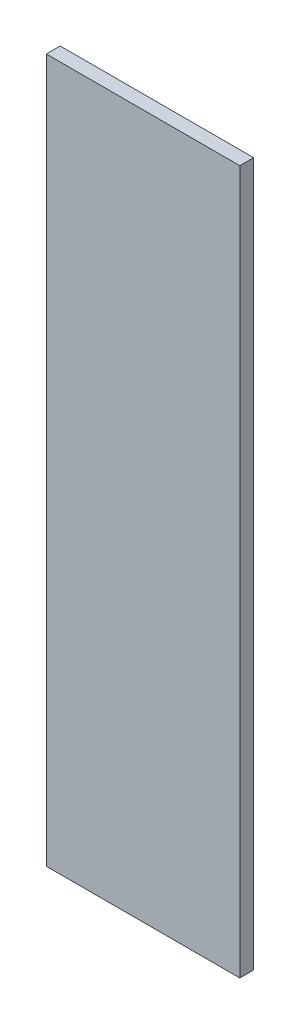
ISO-10303-21;
HEADER;
FILE_DESCRIPTION(('STEP AP214'),'2;1');
FILE_NAME('part.step','',(''),(''),'','','');
FILE_SCHEMA(('AUTOMOTIVE_DESIGN { 1 0 10303 214 1 1 1 1 }'));
ENDSEC;
DATA;
#1=APPLICATION_CONTEXT('core data for automotive mechanical design processes');
#2=APPLICATION_PROTOCOL_DEFINITION('international standard','automotive_design',2000,#1);
#3=PRODUCT_CONTEXT('',#1,'mechanical');
#4=PRODUCT('Part','Part','',(#3));
#5=PRODUCT_RELATED_PRODUCT_CATEGORY('part','',(#4));
#6=PRODUCT_DEFINITION_FORMATION('','',#4);
#7=PRODUCT_DEFINITION_CONTEXT('part definition',#1,'design');
#8=PRODUCT_DEFINITION('design','',#6,#7);
#9=PRODUCT_DEFINITION_SHAPE('','',#8);
#10=(LENGTH_UNIT() NAMED_UNIT(*) SI_UNIT(.MILLI.,.METRE.));
#11=(NAMED_UNIT(*) PLANE_ANGLE_UNIT() SI_UNIT($,.RADIAN.));
#12=(NAMED_UNIT(*) SI_UNIT($,.STERADIAN.) SOLID_ANGLE_UNIT());
#13=UNCERTAINTY_MEASURE_WITH_UNIT(LENGTH_MEASURE(1.E-05),#10,'distance_accuracy_value','');
#14=(GEOMETRIC_REPRESENTATION_CONTEXT(3) GLOBAL_UNCERTAINTY_ASSIGNED_CONTEXT((#13)) GLOBAL_UNIT_ASSIGNED_CONTEXT((#10,
#11,#12)) REPRESENTATION_CONTEXT('',''));
#15=CARTESIAN_POINT('',(0.,0.,0.));
#16=DIRECTION('',(0.,0.,1.));
#17=DIRECTION('',(1.,0.,0.));
#18=AXIS2_PLACEMENT_3D('',#15,#16,#17);
#19=CARTESIAN_POINT('',(0.,0.,0.2));
#20=DIRECTION('',(1.,0.,0.));
#21=DIRECTION('',(0.,0.,-1.));
#22=AXIS2_PLACEMENT_3D('',#19,#20,#21);
#23=PLANE('',#22);
#24=DIRECTION('',(0.,-1.,0.));
#25=VECTOR('',#24,1.);
#26=CARTESIAN_POINT('',(0.,0.,0.));
#27=LINE('',#26,#25);
#28=CARTESIAN_POINT('',(0.,10.16,0.));
#29=VERTEX_POINT('',#28);
#30=CARTESIAN_POINT('',(0.,0.,0.));
#31=VERTEX_POINT('',#30);
#32=EDGE_CURVE('E95',#29,#31,#27,.T.);
#33=ORIENTED_EDGE('',*,*,#32,.T.);
#34=DIRECTION('',(0.,0.,-1.));
#35=VECTOR('',#34,1.);
#36=CARTESIAN_POINT('',(0.,0.,0.2));
#37=LINE('',#36,#35);
#38=CARTESIAN_POINT('',(0.,0.,0.2));
#39=VERTEX_POINT('',#38);
#40=EDGE_CURVE('E11',#39,#31,#37,.T.);
#41=ORIENTED_EDGE('',*,*,#40,.F.);
#42=DIRECTION('',(0.,-1.,0.));
#43=VECTOR('',#42,1.);
#44=CARTESIAN_POINT('',(0.,0.,0.2));
#45=LINE('',#44,#43);
#46=CARTESIAN_POINT('',(0.,10.16,0.2));
#47=VERTEX_POINT('',#46);
#48=EDGE_CURVE('E83',#47,#39,#45,.T.);
#49=ORIENTED_EDGE('',*,*,#48,.F.);
#50=DIRECTION('',(0.,0.,-1.));
#51=VECTOR('',#50,1.);
#52=CARTESIAN_POINT('',(0.,10.16,0.2));
#53=LINE('',#52,#51);
#54=EDGE_CURVE('E91',#47,#29,#53,.T.);
#55=ORIENTED_EDGE('',*,*,#54,.T.);
#56=EDGE_LOOP('',(#33,#41,#49,#55));
#57=FACE_BOUND('',#56,.T.);
#58=ADVANCED_FACE('F32',(#57),#23,.F.);
#59=CARTESIAN_POINT('',(0.,0.,0.2));
#60=DIRECTION('',(0.,1.,0.));
#61=DIRECTION('',(0.,0.,1.));
#62=AXIS2_PLACEMENT_3D('',#59,#60,#61);
#63=PLANE('',#62);
#64=DIRECTION('',(1.,0.,0.));
#65=VECTOR('',#64,1.);
#66=CARTESIAN_POINT('',(0.,0.,0.));
#67=LINE('',#66,#65);
#68=CARTESIAN_POINT('',(2.794,0.,0.));
#69=VERTEX_POINT('',#68);
#70=EDGE_CURVE('E87',#31,#69,#67,.T.);
#71=ORIENTED_EDGE('',*,*,#70,.T.);
#72=DIRECTION('',(0.,0.,-1.));
#73=VECTOR('',#72,1.);
#74=CARTESIAN_POINT('',(2.794,0.,0.2));
#75=LINE('',#74,#73);
#76=CARTESIAN_POINT('',(2.794,0.,0.2));
#77=VERTEX_POINT('',#76);
#78=EDGE_CURVE('E40',#77,#69,#75,.T.);
#79=ORIENTED_EDGE('',*,*,#78,.F.);
#80=DIRECTION('',(1.,0.,0.));
#81=VECTOR('',#80,1.);
#82=CARTESIAN_POINT('',(0.,0.,0.2));
#83=LINE('',#82,#81);
#84=EDGE_CURVE('E78',#39,#77,#83,.T.);
#85=ORIENTED_EDGE('',*,*,#84,.F.);
#86=ORIENTED_EDGE('',*,*,#40,.T.);
#87=EDGE_LOOP('',(#71,#79,#85,#86));
#88=FACE_BOUND('',#87,.T.);
#89=ADVANCED_FACE('F86',(#88),#63,.F.);
#90=CARTESIAN_POINT('',(2.794,0.,0.2));
#91=DIRECTION('',(-1.,0.,0.));
#92=DIRECTION('',(0.,0.,1.));
#93=AXIS2_PLACEMENT_3D('',#90,#91,#92);
#94=PLANE('',#93);
#95=DIRECTION('',(0.,1.,0.));
#96=VECTOR('',#95,1.);
#97=CARTESIAN_POINT('',(2.794,0.,0.));
#98=LINE('',#97,#96);
#99=CARTESIAN_POINT('',(2.794,10.16,0.));
#100=VERTEX_POINT('',#99);
#101=EDGE_CURVE('E65',#69,#100,#98,.T.);
#102=ORIENTED_EDGE('',*,*,#101,.T.);
#103=DIRECTION('',(0.,0.,-1.));
#104=VECTOR('',#103,1.);
#105=CARTESIAN_POINT('',(2.794,10.16,0.2));
#106=LINE('',#105,#104);
#107=CARTESIAN_POINT('',(2.794,10.16,0.2));
#108=VERTEX_POINT('',#107);
#109=EDGE_CURVE('E88',#108,#100,#106,.T.);
#110=ORIENTED_EDGE('',*,*,#109,.F.);
#111=DIRECTION('',(0.,1.,0.));
#112=VECTOR('',#111,1.);
#113=CARTESIAN_POINT('',(2.794,0.,0.2));
#114=LINE('',#113,#112);
#115=EDGE_CURVE('E81',#77,#108,#114,.T.);
#116=ORIENTED_EDGE('',*,*,#115,.F.);
#117=ORIENTED_EDGE('',*,*,#78,.T.);
#118=EDGE_LOOP('',(#102,#110,#116,#117));
#119=FACE_BOUND('',#118,.T.);
#120=ADVANCED_FACE('F89',(#119),#94,.F.);
#121=CARTESIAN_POINT('',(0.,10.16,0.2));
#122=DIRECTION('',(0.,-1.,0.));
#123=DIRECTION('',(0.,0.,-1.));
#124=AXIS2_PLACEMENT_3D('',#121,#122,#123);
#125=PLANE('',#124);
#126=DIRECTION('',(-1.,0.,0.));
#127=VECTOR('',#126,1.);
#128=CARTESIAN_POINT('',(0.,10.16,0.));
#129=LINE('',#128,#127);
#130=EDGE_CURVE('E71',#100,#29,#129,.T.);
#131=ORIENTED_EDGE('',*,*,#130,.T.);
#132=ORIENTED_EDGE('',*,*,#54,.F.);
#133=DIRECTION('',(-1.,0.,0.));
#134=VECTOR('',#133,1.);
#135=CARTESIAN_POINT('',(0.,10.16,0.2));
#136=LINE('',#135,#134);
#137=EDGE_CURVE('E48',#108,#47,#136,.T.);
#138=ORIENTED_EDGE('',*,*,#137,.F.);
#139=ORIENTED_EDGE('',*,*,#109,.T.);
#140=EDGE_LOOP('',(#131,#132,#138,#139));
#141=FACE_BOUND('',#140,.T.);
#142=ADVANCED_FACE('F102',(#141),#125,.F.);
#143=CARTESIAN_POINT('',(0.,0.,0.2));
#144=DIRECTION('',(0.,0.,-1.));
#145=DIRECTION('',(-1.,0.,0.));
#146=AXIS2_PLACEMENT_3D('',#143,#144,#145);
#147=PLANE('',#146);
#148=ORIENTED_EDGE('',*,*,#48,.T.);
#149=ORIENTED_EDGE('',*,*,#84,.T.);
#150=ORIENTED_EDGE('',*,*,#115,.T.);
#151=ORIENTED_EDGE('',*,*,#137,.T.);
#152=EDGE_LOOP('',(#148,#149,#150,#151));
#153=FACE_BOUND('',#152,.T.);
#154=ADVANCED_FACE('F79',(#153),#147,.F.);
#155=CARTESIAN_POINT('',(0.,0.,0.));
#156=DIRECTION('',(0.,0.,-1.));
#157=DIRECTION('',(-1.,0.,0.));
#158=AXIS2_PLACEMENT_3D('',#155,#156,#157);
#159=PLANE('',#158);
#160=ORIENTED_EDGE('',*,*,#32,.F.);
#161=ORIENTED_EDGE('',*,*,#130,.F.);
#162=ORIENTED_EDGE('',*,*,#101,.F.);
#163=ORIENTED_EDGE('',*,*,#70,.F.);
#164=EDGE_LOOP('',(#160,#161,#162,#163));
#165=FACE_BOUND('',#164,.T.);
#166=ADVANCED_FACE('F105',(#165),#159,.T.);
#167=CLOSED_SHELL('',(#58,#89,#120,#142,#154,#166));
#168=MANIFOLD_SOLID_BREP('B2',#167);
#169=ADVANCED_BREP_SHAPE_REPRESENTATION('',(#18,#168),#14);
#170=SHAPE_DEFINITION_REPRESENTATION(#9,#169);
ENDSEC;
END-ISO-10303-21;
